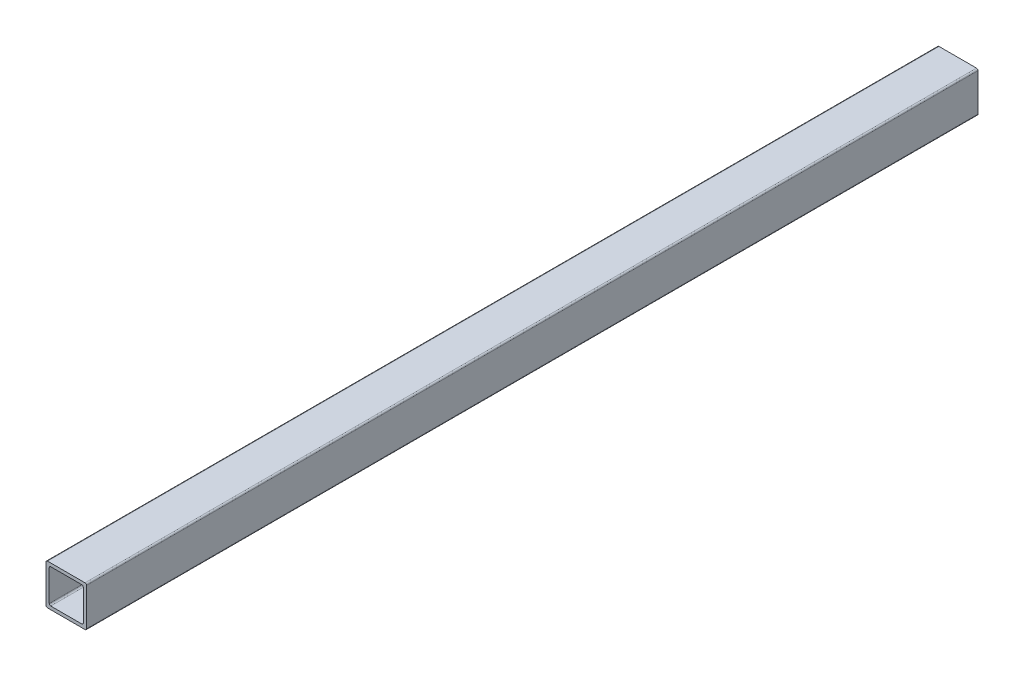
ISO-10303-21;
HEADER;
FILE_DESCRIPTION(('STEP AP214'),'2;1');
FILE_NAME('part.step','',(''),(''),'','','');
FILE_SCHEMA(('AUTOMOTIVE_DESIGN { 1 0 10303 214 1 1 1 1 }'));
ENDSEC;
DATA;
#1=APPLICATION_CONTEXT('core data for automotive mechanical design processes');
#2=APPLICATION_PROTOCOL_DEFINITION('international standard','automotive_design',2000,#1);
#3=PRODUCT_CONTEXT('',#1,'mechanical');
#4=PRODUCT('Part','Part','',(#3));
#5=PRODUCT_RELATED_PRODUCT_CATEGORY('part','',(#4));
#6=PRODUCT_DEFINITION_FORMATION('','',#4);
#7=PRODUCT_DEFINITION_CONTEXT('part definition',#1,'design');
#8=PRODUCT_DEFINITION('design','',#6,#7);
#9=PRODUCT_DEFINITION_SHAPE('','',#8);
#10=(LENGTH_UNIT() NAMED_UNIT(*) SI_UNIT(.MILLI.,.METRE.));
#11=(NAMED_UNIT(*) PLANE_ANGLE_UNIT() SI_UNIT($,.RADIAN.));
#12=(NAMED_UNIT(*) SI_UNIT($,.STERADIAN.) SOLID_ANGLE_UNIT());
#13=UNCERTAINTY_MEASURE_WITH_UNIT(LENGTH_MEASURE(1.E-05),#10,'distance_accuracy_value','');
#14=(GEOMETRIC_REPRESENTATION_CONTEXT(3) GLOBAL_UNCERTAINTY_ASSIGNED_CONTEXT((#13)) GLOBAL_UNIT_ASSIGNED_CONTEXT((#10,
#11,#12)) REPRESENTATION_CONTEXT('',''));
#15=CARTESIAN_POINT('',(0.,0.,0.));
#16=DIRECTION('',(0.,0.,1.));
#17=DIRECTION('',(1.,0.,0.));
#18=AXIS2_PLACEMENT_3D('',#15,#16,#17);
#19=CARTESIAN_POINT('',(23.153,23.153,1100.));
#20=DIRECTION('',(0.,0.,-1.));
#21=DIRECTION('',(-1.,0.,0.));
#22=AXIS2_PLACEMENT_3D('',#19,#20,#21);
#23=PLANE('',#22);
#24=CARTESIAN_POINT('',(23.153,23.153,1100.));
#25=DIRECTION('',(0.,0.,1.));
#26=DIRECTION('',(-1.,0.,0.));
#27=AXIS2_PLACEMENT_3D('',#24,#25,#26);
#28=CIRCLE('',#27,1.847);
#29=CARTESIAN_POINT('',(25.,23.153,1100.));
#30=VERTEX_POINT('',#29);
#31=CARTESIAN_POINT('',(23.153,25.,1100.));
#32=VERTEX_POINT('',#31);
#33=EDGE_CURVE('E195',#30,#32,#28,.T.);
#34=ORIENTED_EDGE('',*,*,#33,.T.);
#35=DIRECTION('',(-1.,0.,0.));
#36=VECTOR('',#35,1.);
#37=CARTESIAN_POINT('',(-23.153,25.,1100.));
#38=LINE('',#37,#36);
#39=CARTESIAN_POINT('',(-23.153,25.,1100.));
#40=VERTEX_POINT('',#39);
#41=EDGE_CURVE('E198',#32,#40,#38,.T.);
#42=ORIENTED_EDGE('',*,*,#41,.T.);
#43=CARTESIAN_POINT('',(-23.153,23.153,1100.));
#44=DIRECTION('',(0.,0.,1.));
#45=DIRECTION('',(1.,0.,0.));
#46=AXIS2_PLACEMENT_3D('',#43,#44,#45);
#47=CIRCLE('',#46,1.847);
#48=CARTESIAN_POINT('',(-25.,23.153,1100.));
#49=VERTEX_POINT('',#48);
#50=EDGE_CURVE('E201',#40,#49,#47,.T.);
#51=ORIENTED_EDGE('',*,*,#50,.T.);
#52=DIRECTION('',(0.,-1.,0.));
#53=VECTOR('',#52,1.);
#54=CARTESIAN_POINT('',(-25.,23.153,1100.));
#55=LINE('',#54,#53);
#56=CARTESIAN_POINT('',(-25.,-23.153,1100.));
#57=VERTEX_POINT('',#56);
#58=EDGE_CURVE('E203',#49,#57,#55,.T.);
#59=ORIENTED_EDGE('',*,*,#58,.T.);
#60=CARTESIAN_POINT('',(-23.153,-23.153,1100.));
#61=DIRECTION('',(0.,0.,1.));
#62=DIRECTION('',(1.,0.,0.));
#63=AXIS2_PLACEMENT_3D('',#60,#61,#62);
#64=CIRCLE('',#63,1.847);
#65=CARTESIAN_POINT('',(-23.153,-25.,1100.));
#66=VERTEX_POINT('',#65);
#67=EDGE_CURVE('E205',#57,#66,#64,.T.);
#68=ORIENTED_EDGE('',*,*,#67,.T.);
#69=DIRECTION('',(1.,0.,0.));
#70=VECTOR('',#69,1.);
#71=CARTESIAN_POINT('',(-23.153,-25.,1100.));
#72=LINE('',#71,#70);
#73=CARTESIAN_POINT('',(23.153,-25.,1100.));
#74=VERTEX_POINT('',#73);
#75=EDGE_CURVE('E207',#66,#74,#72,.T.);
#76=ORIENTED_EDGE('',*,*,#75,.T.);
#77=CARTESIAN_POINT('',(23.153,-23.153,1100.));
#78=DIRECTION('',(0.,0.,1.));
#79=DIRECTION('',(1.,0.,0.));
#80=AXIS2_PLACEMENT_3D('',#77,#78,#79);
#81=CIRCLE('',#80,1.847);
#82=CARTESIAN_POINT('',(25.,-23.153,1100.));
#83=VERTEX_POINT('',#82);
#84=EDGE_CURVE('E209',#74,#83,#81,.T.);
#85=ORIENTED_EDGE('',*,*,#84,.T.);
#86=DIRECTION('',(0.,1.,0.));
#87=VECTOR('',#86,1.);
#88=CARTESIAN_POINT('',(25.,23.153,1100.));
#89=LINE('',#88,#87);
#90=EDGE_CURVE('E211',#83,#30,#89,.T.);
#91=ORIENTED_EDGE('',*,*,#90,.T.);
#92=EDGE_LOOP('',(#34,#42,#51,#59,#68,#76,#85,#91));
#93=FACE_BOUND('',#92,.T.);
#94=CARTESIAN_POINT('',(19.153,-19.153,1100.));
#95=DIRECTION('',(0.,0.,1.));
#96=DIRECTION('',(1.,0.,0.));
#97=AXIS2_PLACEMENT_3D('',#94,#95,#96);
#98=CIRCLE('',#97,1.847);
#99=CARTESIAN_POINT('',(19.153,-21.,1100.));
#100=VERTEX_POINT('',#99);
#101=CARTESIAN_POINT('',(21.,-19.153,1100.));
#102=VERTEX_POINT('',#101);
#103=EDGE_CURVE('E130',#100,#102,#98,.T.);
#104=ORIENTED_EDGE('',*,*,#103,.F.);
#105=DIRECTION('',(1.,0.,0.));
#106=VECTOR('',#105,1.);
#107=CARTESIAN_POINT('',(-19.153,-21.,1100.));
#108=LINE('',#107,#106);
#109=CARTESIAN_POINT('',(-19.153,-21.,1100.));
#110=VERTEX_POINT('',#109);
#111=EDGE_CURVE('E163',#110,#100,#108,.T.);
#112=ORIENTED_EDGE('',*,*,#111,.F.);
#113=CARTESIAN_POINT('',(-19.153,-19.153,1100.));
#114=DIRECTION('',(0.,0.,1.));
#115=DIRECTION('',(1.,0.,0.));
#116=AXIS2_PLACEMENT_3D('',#113,#114,#115);
#117=CIRCLE('',#116,1.847);
#118=CARTESIAN_POINT('',(-21.,-19.153,1100.));
#119=VERTEX_POINT('',#118);
#120=EDGE_CURVE('E161',#119,#110,#117,.T.);
#121=ORIENTED_EDGE('',*,*,#120,.F.);
#122=DIRECTION('',(0.,-1.,0.));
#123=VECTOR('',#122,1.);
#124=CARTESIAN_POINT('',(-21.,19.153,1100.));
#125=LINE('',#124,#123);
#126=CARTESIAN_POINT('',(-21.,19.153,1100.));
#127=VERTEX_POINT('',#126);
#128=EDGE_CURVE('E159',#127,#119,#125,.T.);
#129=ORIENTED_EDGE('',*,*,#128,.F.);
#130=CARTESIAN_POINT('',(-19.153,19.153,1100.));
#131=DIRECTION('',(0.,0.,1.));
#132=DIRECTION('',(1.,0.,0.));
#133=AXIS2_PLACEMENT_3D('',#130,#131,#132);
#134=CIRCLE('',#133,1.847);
#135=CARTESIAN_POINT('',(-19.153,21.,1100.));
#136=VERTEX_POINT('',#135);
#137=EDGE_CURVE('E157',#136,#127,#134,.T.);
#138=ORIENTED_EDGE('',*,*,#137,.F.);
#139=DIRECTION('',(-1.,0.,0.));
#140=VECTOR('',#139,1.);
#141=CARTESIAN_POINT('',(-19.153,21.,1100.));
#142=LINE('',#141,#140);
#143=CARTESIAN_POINT('',(19.153,21.,1100.));
#144=VERTEX_POINT('',#143);
#145=EDGE_CURVE('E153',#144,#136,#142,.T.);
#146=ORIENTED_EDGE('',*,*,#145,.F.);
#147=CARTESIAN_POINT('',(19.153,19.153,1100.));
#148=DIRECTION('',(0.,0.,1.));
#149=DIRECTION('',(-1.,0.,0.));
#150=AXIS2_PLACEMENT_3D('',#147,#148,#149);
#151=CIRCLE('',#150,1.847);
#152=CARTESIAN_POINT('',(21.,19.153,1100.));
#153=VERTEX_POINT('',#152);
#154=EDGE_CURVE('E151',#153,#144,#151,.T.);
#155=ORIENTED_EDGE('',*,*,#154,.F.);
#156=DIRECTION('',(0.,1.,0.));
#157=VECTOR('',#156,1.);
#158=CARTESIAN_POINT('',(21.,19.153,1100.));
#159=LINE('',#158,#157);
#160=EDGE_CURVE('E138',#102,#153,#159,.T.);
#161=ORIENTED_EDGE('',*,*,#160,.F.);
#162=EDGE_LOOP('',(#104,#112,#121,#129,#138,#146,#155,#161));
#163=FACE_BOUND('',#162,.T.);
#164=ADVANCED_FACE('F17',(#93,#163),#23,.F.);
#165=CARTESIAN_POINT('',(23.153,23.153,0.));
#166=DIRECTION('',(0.,0.,-1.));
#167=DIRECTION('',(-1.,0.,0.));
#168=AXIS2_PLACEMENT_3D('',#165,#166,#167);
#169=PLANE('',#168);
#170=CARTESIAN_POINT('',(23.153,23.153,0.));
#171=DIRECTION('',(0.,0.,1.));
#172=DIRECTION('',(-1.,0.,0.));
#173=AXIS2_PLACEMENT_3D('',#170,#171,#172);
#174=CIRCLE('',#173,1.847);
#175=CARTESIAN_POINT('',(25.,23.153,0.));
#176=VERTEX_POINT('',#175);
#177=CARTESIAN_POINT('',(23.153,25.,0.));
#178=VERTEX_POINT('',#177);
#179=EDGE_CURVE('E146',#176,#178,#174,.T.);
#180=ORIENTED_EDGE('',*,*,#179,.F.);
#181=DIRECTION('',(0.,1.,0.));
#182=VECTOR('',#181,1.);
#183=CARTESIAN_POINT('',(25.,23.153,0.));
#184=LINE('',#183,#182);
#185=CARTESIAN_POINT('',(25.,-23.153,0.));
#186=VERTEX_POINT('',#185);
#187=EDGE_CURVE('E199',#186,#176,#184,.T.);
#188=ORIENTED_EDGE('',*,*,#187,.F.);
#189=CARTESIAN_POINT('',(23.153,-23.153,0.));
#190=DIRECTION('',(0.,0.,1.));
#191=DIRECTION('',(1.,0.,0.));
#192=AXIS2_PLACEMENT_3D('',#189,#190,#191);
#193=CIRCLE('',#192,1.847);
#194=CARTESIAN_POINT('',(23.153,-25.,0.));
#195=VERTEX_POINT('',#194);
#196=EDGE_CURVE('E226',#195,#186,#193,.T.);
#197=ORIENTED_EDGE('',*,*,#196,.F.);
#198=DIRECTION('',(1.,0.,0.));
#199=VECTOR('',#198,1.);
#200=CARTESIAN_POINT('',(-23.153,-25.,0.));
#201=LINE('',#200,#199);
#202=CARTESIAN_POINT('',(-23.153,-25.,0.));
#203=VERTEX_POINT('',#202);
#204=EDGE_CURVE('E224',#203,#195,#201,.T.);
#205=ORIENTED_EDGE('',*,*,#204,.F.);
#206=CARTESIAN_POINT('',(-23.153,-23.153,0.));
#207=DIRECTION('',(0.,0.,1.));
#208=DIRECTION('',(1.,0.,0.));
#209=AXIS2_PLACEMENT_3D('',#206,#207,#208);
#210=CIRCLE('',#209,1.847);
#211=CARTESIAN_POINT('',(-25.,-23.153,0.));
#212=VERTEX_POINT('',#211);
#213=EDGE_CURVE('E222',#212,#203,#210,.T.);
#214=ORIENTED_EDGE('',*,*,#213,.F.);
#215=DIRECTION('',(0.,-1.,0.));
#216=VECTOR('',#215,1.);
#217=CARTESIAN_POINT('',(-25.,23.153,0.));
#218=LINE('',#217,#216);
#219=CARTESIAN_POINT('',(-25.,23.153,0.));
#220=VERTEX_POINT('',#219);
#221=EDGE_CURVE('E220',#220,#212,#218,.T.);
#222=ORIENTED_EDGE('',*,*,#221,.F.);
#223=CARTESIAN_POINT('',(-23.153,23.153,0.));
#224=DIRECTION('',(0.,0.,1.));
#225=DIRECTION('',(1.,0.,0.));
#226=AXIS2_PLACEMENT_3D('',#223,#224,#225);
#227=CIRCLE('',#226,1.847);
#228=CARTESIAN_POINT('',(-23.153,25.,0.));
#229=VERTEX_POINT('',#228);
#230=EDGE_CURVE('E218',#229,#220,#227,.T.);
#231=ORIENTED_EDGE('',*,*,#230,.F.);
#232=DIRECTION('',(-1.,0.,0.));
#233=VECTOR('',#232,1.);
#234=CARTESIAN_POINT('',(-23.153,25.,0.));
#235=LINE('',#234,#233);
#236=EDGE_CURVE('E216',#178,#229,#235,.T.);
#237=ORIENTED_EDGE('',*,*,#236,.F.);
#238=EDGE_LOOP('',(#180,#188,#197,#205,#214,#222,#231,#237));
#239=FACE_BOUND('',#238,.T.);
#240=DIRECTION('',(1.,0.,0.));
#241=VECTOR('',#240,1.);
#242=CARTESIAN_POINT('',(-19.153,-21.,0.));
#243=LINE('',#242,#241);
#244=CARTESIAN_POINT('',(-19.153,-21.,0.));
#245=VERTEX_POINT('',#244);
#246=CARTESIAN_POINT('',(19.153,-21.,0.));
#247=VERTEX_POINT('',#246);
#248=EDGE_CURVE('E139',#245,#247,#243,.T.);
#249=ORIENTED_EDGE('',*,*,#248,.T.);
#250=CARTESIAN_POINT('',(19.153,-19.153,0.));
#251=DIRECTION('',(0.,0.,1.));
#252=DIRECTION('',(1.,0.,0.));
#253=AXIS2_PLACEMENT_3D('',#250,#251,#252);
#254=CIRCLE('',#253,1.847);
#255=CARTESIAN_POINT('',(21.,-19.153,0.));
#256=VERTEX_POINT('',#255);
#257=EDGE_CURVE('E40',#247,#256,#254,.T.);
#258=ORIENTED_EDGE('',*,*,#257,.T.);
#259=DIRECTION('',(0.,1.,0.));
#260=VECTOR('',#259,1.);
#261=CARTESIAN_POINT('',(21.,19.153,0.));
#262=LINE('',#261,#260);
#263=CARTESIAN_POINT('',(21.,19.153,0.));
#264=VERTEX_POINT('',#263);
#265=EDGE_CURVE('E145',#256,#264,#262,.T.);
#266=ORIENTED_EDGE('',*,*,#265,.T.);
#267=CARTESIAN_POINT('',(19.153,19.153,0.));
#268=DIRECTION('',(0.,0.,1.));
#269=DIRECTION('',(-1.,0.,0.));
#270=AXIS2_PLACEMENT_3D('',#267,#268,#269);
#271=CIRCLE('',#270,1.847);
#272=CARTESIAN_POINT('',(19.153,21.,0.));
#273=VERTEX_POINT('',#272);
#274=EDGE_CURVE('E167',#264,#273,#271,.T.);
#275=ORIENTED_EDGE('',*,*,#274,.T.);
#276=DIRECTION('',(-1.,0.,0.));
#277=VECTOR('',#276,1.);
#278=CARTESIAN_POINT('',(-19.153,21.,0.));
#279=LINE('',#278,#277);
#280=CARTESIAN_POINT('',(-19.153,21.,0.));
#281=VERTEX_POINT('',#280);
#282=EDGE_CURVE('E170',#273,#281,#279,.T.);
#283=ORIENTED_EDGE('',*,*,#282,.T.);
#284=CARTESIAN_POINT('',(-19.153,19.153,0.));
#285=DIRECTION('',(0.,0.,1.));
#286=DIRECTION('',(1.,0.,0.));
#287=AXIS2_PLACEMENT_3D('',#284,#285,#286);
#288=CIRCLE('',#287,1.847);
#289=CARTESIAN_POINT('',(-21.,19.153,0.));
#290=VERTEX_POINT('',#289);
#291=EDGE_CURVE('E173',#281,#290,#288,.T.);
#292=ORIENTED_EDGE('',*,*,#291,.T.);
#293=DIRECTION('',(0.,-1.,0.));
#294=VECTOR('',#293,1.);
#295=CARTESIAN_POINT('',(-21.,19.153,0.));
#296=LINE('',#295,#294);
#297=CARTESIAN_POINT('',(-21.,-19.153,0.));
#298=VERTEX_POINT('',#297);
#299=EDGE_CURVE('E176',#290,#298,#296,.T.);
#300=ORIENTED_EDGE('',*,*,#299,.T.);
#301=CARTESIAN_POINT('',(-19.153,-19.153,0.));
#302=DIRECTION('',(0.,0.,1.));
#303=DIRECTION('',(1.,0.,0.));
#304=AXIS2_PLACEMENT_3D('',#301,#302,#303);
#305=CIRCLE('',#304,1.847);
#306=EDGE_CURVE('E179',#298,#245,#305,.T.);
#307=ORIENTED_EDGE('',*,*,#306,.T.);
#308=EDGE_LOOP('',(#249,#258,#266,#275,#283,#292,#300,#307));
#309=FACE_BOUND('',#308,.T.);
#310=ADVANCED_FACE('F256',(#239,#309),#169,.T.);
#311=CARTESIAN_POINT('',(23.153,23.153,1100.));
#312=DIRECTION('',(0.,0.,-1.));
#313=DIRECTION('',(-1.,0.,0.));
#314=AXIS2_PLACEMENT_3D('',#311,#312,#313);
#315=CYLINDRICAL_SURFACE('',#314,1.847);
#316=ORIENTED_EDGE('',*,*,#179,.T.);
#317=DIRECTION('',(0.,0.,-1.));
#318=VECTOR('',#317,1.);
#319=CARTESIAN_POINT('',(23.153,25.,1100.));
#320=LINE('',#319,#318);
#321=EDGE_CURVE('E11',#32,#178,#320,.T.);
#322=ORIENTED_EDGE('',*,*,#321,.F.);
#323=ORIENTED_EDGE('',*,*,#33,.F.);
#324=DIRECTION('',(0.,0.,-1.));
#325=VECTOR('',#324,1.);
#326=CARTESIAN_POINT('',(25.,23.153,1100.));
#327=LINE('',#326,#325);
#328=EDGE_CURVE('E213',#30,#176,#327,.T.);
#329=ORIENTED_EDGE('',*,*,#328,.T.);
#330=EDGE_LOOP('',(#316,#322,#323,#329));
#331=FACE_BOUND('',#330,.T.);
#332=ADVANCED_FACE('F19',(#331),#315,.T.);
#333=CARTESIAN_POINT('',(-23.153,25.,1100.));
#334=DIRECTION('',(0.,-1.,0.));
#335=DIRECTION('',(0.,0.,-1.));
#336=AXIS2_PLACEMENT_3D('',#333,#334,#335);
#337=PLANE('',#336);
#338=ORIENTED_EDGE('',*,*,#236,.T.);
#339=DIRECTION('',(0.,0.,-1.));
#340=VECTOR('',#339,1.);
#341=CARTESIAN_POINT('',(-23.153,25.,1100.));
#342=LINE('',#341,#340);
#343=EDGE_CURVE('E25',#40,#229,#342,.T.);
#344=ORIENTED_EDGE('',*,*,#343,.F.);
#345=ORIENTED_EDGE('',*,*,#41,.F.);
#346=ORIENTED_EDGE('',*,*,#321,.T.);
#347=EDGE_LOOP('',(#338,#344,#345,#346));
#348=FACE_BOUND('',#347,.T.);
#349=ADVANCED_FACE('F273',(#348),#337,.F.);
#350=CARTESIAN_POINT('',(-23.153,23.153,1100.));
#351=DIRECTION('',(0.,0.,-1.));
#352=DIRECTION('',(-1.,0.,0.));
#353=AXIS2_PLACEMENT_3D('',#350,#351,#352);
#354=CYLINDRICAL_SURFACE('',#353,1.847);
#355=ORIENTED_EDGE('',*,*,#230,.T.);
#356=DIRECTION('',(0.,0.,-1.));
#357=VECTOR('',#356,1.);
#358=CARTESIAN_POINT('',(-25.,23.153,1100.));
#359=LINE('',#358,#357);
#360=EDGE_CURVE('E243',#49,#220,#359,.T.);
#361=ORIENTED_EDGE('',*,*,#360,.F.);
#362=ORIENTED_EDGE('',*,*,#50,.F.);
#363=ORIENTED_EDGE('',*,*,#343,.T.);
#364=EDGE_LOOP('',(#355,#361,#362,#363));
#365=FACE_BOUND('',#364,.T.);
#366=ADVANCED_FACE('F250',(#365),#354,.T.);
#367=CARTESIAN_POINT('',(-25.,23.153,1100.));
#368=DIRECTION('',(1.,0.,0.));
#369=DIRECTION('',(0.,0.,-1.));
#370=AXIS2_PLACEMENT_3D('',#367,#368,#369);
#371=PLANE('',#370);
#372=ORIENTED_EDGE('',*,*,#221,.T.);
#373=DIRECTION('',(0.,0.,-1.));
#374=VECTOR('',#373,1.);
#375=CARTESIAN_POINT('',(-25.,-23.153,1100.));
#376=LINE('',#375,#374);
#377=EDGE_CURVE('E240',#57,#212,#376,.T.);
#378=ORIENTED_EDGE('',*,*,#377,.F.);
#379=ORIENTED_EDGE('',*,*,#58,.F.);
#380=ORIENTED_EDGE('',*,*,#360,.T.);
#381=EDGE_LOOP('',(#372,#378,#379,#380));
#382=FACE_BOUND('',#381,.T.);
#383=ADVANCED_FACE('F262',(#382),#371,.F.);
#384=CARTESIAN_POINT('',(-23.153,-23.153,1100.));
#385=DIRECTION('',(0.,0.,-1.));
#386=DIRECTION('',(-1.,0.,0.));
#387=AXIS2_PLACEMENT_3D('',#384,#385,#386);
#388=CYLINDRICAL_SURFACE('',#387,1.847);
#389=ORIENTED_EDGE('',*,*,#213,.T.);
#390=DIRECTION('',(0.,0.,-1.));
#391=VECTOR('',#390,1.);
#392=CARTESIAN_POINT('',(-23.153,-25.,1100.));
#393=LINE('',#392,#391);
#394=EDGE_CURVE('E237',#66,#203,#393,.T.);
#395=ORIENTED_EDGE('',*,*,#394,.F.);
#396=ORIENTED_EDGE('',*,*,#67,.F.);
#397=ORIENTED_EDGE('',*,*,#377,.T.);
#398=EDGE_LOOP('',(#389,#395,#396,#397));
#399=FACE_BOUND('',#398,.T.);
#400=ADVANCED_FACE('F266',(#399),#388,.T.);
#401=CARTESIAN_POINT('',(-23.153,-25.,1100.));
#402=DIRECTION('',(0.,1.,0.));
#403=DIRECTION('',(0.,0.,1.));
#404=AXIS2_PLACEMENT_3D('',#401,#402,#403);
#405=PLANE('',#404);
#406=ORIENTED_EDGE('',*,*,#204,.T.);
#407=DIRECTION('',(0.,0.,-1.));
#408=VECTOR('',#407,1.);
#409=CARTESIAN_POINT('',(23.153,-25.,1100.));
#410=LINE('',#409,#408);
#411=EDGE_CURVE('E234',#74,#195,#410,.T.);
#412=ORIENTED_EDGE('',*,*,#411,.F.);
#413=ORIENTED_EDGE('',*,*,#75,.F.);
#414=ORIENTED_EDGE('',*,*,#394,.T.);
#415=EDGE_LOOP('',(#406,#412,#413,#414));
#416=FACE_BOUND('',#415,.T.);
#417=ADVANCED_FACE('F286',(#416),#405,.F.);
#418=CARTESIAN_POINT('',(23.153,-23.153,1100.));
#419=DIRECTION('',(0.,0.,-1.));
#420=DIRECTION('',(-1.,0.,0.));
#421=AXIS2_PLACEMENT_3D('',#418,#419,#420);
#422=CYLINDRICAL_SURFACE('',#421,1.847);
#423=ORIENTED_EDGE('',*,*,#196,.T.);
#424=DIRECTION('',(0.,0.,-1.));
#425=VECTOR('',#424,1.);
#426=CARTESIAN_POINT('',(25.,-23.153,1100.));
#427=LINE('',#426,#425);
#428=EDGE_CURVE('E231',#83,#186,#427,.T.);
#429=ORIENTED_EDGE('',*,*,#428,.F.);
#430=ORIENTED_EDGE('',*,*,#84,.F.);
#431=ORIENTED_EDGE('',*,*,#411,.T.);
#432=EDGE_LOOP('',(#423,#429,#430,#431));
#433=FACE_BOUND('',#432,.T.);
#434=ADVANCED_FACE('F284',(#433),#422,.T.);
#435=CARTESIAN_POINT('',(25.,23.153,1100.));
#436=DIRECTION('',(-1.,0.,0.));
#437=DIRECTION('',(0.,0.,1.));
#438=AXIS2_PLACEMENT_3D('',#435,#436,#437);
#439=PLANE('',#438);
#440=ORIENTED_EDGE('',*,*,#187,.T.);
#441=ORIENTED_EDGE('',*,*,#328,.F.);
#442=ORIENTED_EDGE('',*,*,#90,.F.);
#443=ORIENTED_EDGE('',*,*,#428,.T.);
#444=EDGE_LOOP('',(#440,#441,#442,#443));
#445=FACE_BOUND('',#444,.T.);
#446=ADVANCED_FACE('F279',(#445),#439,.F.);
#447=CARTESIAN_POINT('',(19.153,-19.153,1100.));
#448=DIRECTION('',(0.,0.,-1.));
#449=DIRECTION('',(-1.,0.,0.));
#450=AXIS2_PLACEMENT_3D('',#447,#448,#449);
#451=CYLINDRICAL_SURFACE('',#450,1.847);
#452=ORIENTED_EDGE('',*,*,#257,.F.);
#453=DIRECTION('',(0.,0.,-1.));
#454=VECTOR('',#453,1.);
#455=CARTESIAN_POINT('',(19.153,-21.,1100.));
#456=LINE('',#455,#454);
#457=EDGE_CURVE('E134',#100,#247,#456,.T.);
#458=ORIENTED_EDGE('',*,*,#457,.F.);
#459=ORIENTED_EDGE('',*,*,#103,.T.);
#460=DIRECTION('',(0.,0.,-1.));
#461=VECTOR('',#460,1.);
#462=CARTESIAN_POINT('',(21.,-19.153,1100.));
#463=LINE('',#462,#461);
#464=EDGE_CURVE('E133',#102,#256,#463,.T.);
#465=ORIENTED_EDGE('',*,*,#464,.T.);
#466=EDGE_LOOP('',(#452,#458,#459,#465));
#467=FACE_BOUND('',#466,.T.);
#468=ADVANCED_FACE('F132',(#467),#451,.F.);
#469=CARTESIAN_POINT('',(21.,19.153,1100.));
#470=DIRECTION('',(-1.,0.,0.));
#471=DIRECTION('',(0.,-1.,0.));
#472=AXIS2_PLACEMENT_3D('',#469,#470,#471);
#473=PLANE('',#472);
#474=ORIENTED_EDGE('',*,*,#265,.F.);
#475=ORIENTED_EDGE('',*,*,#464,.F.);
#476=ORIENTED_EDGE('',*,*,#160,.T.);
#477=DIRECTION('',(0.,0.,-1.));
#478=VECTOR('',#477,1.);
#479=CARTESIAN_POINT('',(21.,19.153,1100.));
#480=LINE('',#479,#478);
#481=EDGE_CURVE('E147',#153,#264,#480,.T.);
#482=ORIENTED_EDGE('',*,*,#481,.T.);
#483=EDGE_LOOP('',(#474,#475,#476,#482));
#484=FACE_BOUND('',#483,.T.);
#485=ADVANCED_FACE('F142',(#484),#473,.T.);
#486=CARTESIAN_POINT('',(19.153,19.153,1100.));
#487=DIRECTION('',(0.,0.,-1.));
#488=DIRECTION('',(-1.,0.,0.));
#489=AXIS2_PLACEMENT_3D('',#486,#487,#488);
#490=CYLINDRICAL_SURFACE('',#489,1.847);
#491=ORIENTED_EDGE('',*,*,#274,.F.);
#492=ORIENTED_EDGE('',*,*,#481,.F.);
#493=ORIENTED_EDGE('',*,*,#154,.T.);
#494=DIRECTION('',(0.,0.,-1.));
#495=VECTOR('',#494,1.);
#496=CARTESIAN_POINT('',(19.153,21.,1100.));
#497=LINE('',#496,#495);
#498=EDGE_CURVE('E192',#144,#273,#497,.T.);
#499=ORIENTED_EDGE('',*,*,#498,.T.);
#500=EDGE_LOOP('',(#491,#492,#493,#499));
#501=FACE_BOUND('',#500,.T.);
#502=ADVANCED_FACE('F316',(#501),#490,.F.);
#503=CARTESIAN_POINT('',(-19.153,21.,1100.));
#504=DIRECTION('',(0.,-1.,0.));
#505=DIRECTION('',(1.,0.,0.));
#506=AXIS2_PLACEMENT_3D('',#503,#504,#505);
#507=PLANE('',#506);
#508=ORIENTED_EDGE('',*,*,#282,.F.);
#509=ORIENTED_EDGE('',*,*,#498,.F.);
#510=ORIENTED_EDGE('',*,*,#145,.T.);
#511=DIRECTION('',(0.,0.,-1.));
#512=VECTOR('',#511,1.);
#513=CARTESIAN_POINT('',(-19.153,21.,1100.));
#514=LINE('',#513,#512);
#515=EDGE_CURVE('E190',#136,#281,#514,.T.);
#516=ORIENTED_EDGE('',*,*,#515,.T.);
#517=EDGE_LOOP('',(#508,#509,#510,#516));
#518=FACE_BOUND('',#517,.T.);
#519=ADVANCED_FACE('F321',(#518),#507,.T.);
#520=CARTESIAN_POINT('',(-19.153,19.153,1100.));
#521=DIRECTION('',(0.,0.,-1.));
#522=DIRECTION('',(-1.,0.,0.));
#523=AXIS2_PLACEMENT_3D('',#520,#521,#522);
#524=CYLINDRICAL_SURFACE('',#523,1.847);
#525=ORIENTED_EDGE('',*,*,#291,.F.);
#526=ORIENTED_EDGE('',*,*,#515,.F.);
#527=ORIENTED_EDGE('',*,*,#137,.T.);
#528=DIRECTION('',(0.,0.,-1.));
#529=VECTOR('',#528,1.);
#530=CARTESIAN_POINT('',(-21.,19.153,1100.));
#531=LINE('',#530,#529);
#532=EDGE_CURVE('E188',#127,#290,#531,.T.);
#533=ORIENTED_EDGE('',*,*,#532,.T.);
#534=EDGE_LOOP('',(#525,#526,#527,#533));
#535=FACE_BOUND('',#534,.T.);
#536=ADVANCED_FACE('F327',(#535),#524,.F.);
#537=CARTESIAN_POINT('',(-21.,19.153,1100.));
#538=DIRECTION('',(1.,0.,0.));
#539=DIRECTION('',(0.,0.,-1.));
#540=AXIS2_PLACEMENT_3D('',#537,#538,#539);
#541=PLANE('',#540);
#542=ORIENTED_EDGE('',*,*,#299,.F.);
#543=ORIENTED_EDGE('',*,*,#532,.F.);
#544=ORIENTED_EDGE('',*,*,#128,.T.);
#545=DIRECTION('',(0.,0.,-1.));
#546=VECTOR('',#545,1.);
#547=CARTESIAN_POINT('',(-21.,-19.153,1100.));
#548=LINE('',#547,#546);
#549=EDGE_CURVE('E186',#119,#298,#548,.T.);
#550=ORIENTED_EDGE('',*,*,#549,.T.);
#551=EDGE_LOOP('',(#542,#543,#544,#550));
#552=FACE_BOUND('',#551,.T.);
#553=ADVANCED_FACE('F331',(#552),#541,.T.);
#554=CARTESIAN_POINT('',(-19.153,-19.153,1100.));
#555=DIRECTION('',(0.,0.,-1.));
#556=DIRECTION('',(-1.,0.,0.));
#557=AXIS2_PLACEMENT_3D('',#554,#555,#556);
#558=CYLINDRICAL_SURFACE('',#557,1.847);
#559=ORIENTED_EDGE('',*,*,#306,.F.);
#560=ORIENTED_EDGE('',*,*,#549,.F.);
#561=ORIENTED_EDGE('',*,*,#120,.T.);
#562=DIRECTION('',(0.,0.,-1.));
#563=VECTOR('',#562,1.);
#564=CARTESIAN_POINT('',(-19.153,-21.,1100.));
#565=LINE('',#564,#563);
#566=EDGE_CURVE('E32',#110,#245,#565,.T.);
#567=ORIENTED_EDGE('',*,*,#566,.T.);
#568=EDGE_LOOP('',(#559,#560,#561,#567));
#569=FACE_BOUND('',#568,.T.);
#570=ADVANCED_FACE('F335',(#569),#558,.F.);
#571=CARTESIAN_POINT('',(-19.153,-21.,1100.));
#572=DIRECTION('',(0.,1.,0.));
#573=DIRECTION('',(-1.,0.,0.));
#574=AXIS2_PLACEMENT_3D('',#571,#572,#573);
#575=PLANE('',#574);
#576=ORIENTED_EDGE('',*,*,#248,.F.);
#577=ORIENTED_EDGE('',*,*,#566,.F.);
#578=ORIENTED_EDGE('',*,*,#111,.T.);
#579=ORIENTED_EDGE('',*,*,#457,.T.);
#580=EDGE_LOOP('',(#576,#577,#578,#579));
#581=FACE_BOUND('',#580,.T.);
#582=ADVANCED_FACE('F339',(#581),#575,.T.);
#583=CLOSED_SHELL('',(#164,#310,#332,#349,#366,#383,#400,#417,#434,#446,#468,#485,#502,#519,
#536,#553,#570,#582));
#584=MANIFOLD_SOLID_BREP('B1',#583);
#585=ADVANCED_BREP_SHAPE_REPRESENTATION('',(#18,#584),#14);
#586=SHAPE_DEFINITION_REPRESENTATION(#9,#585);
ENDSEC;
END-ISO-10303-21;
